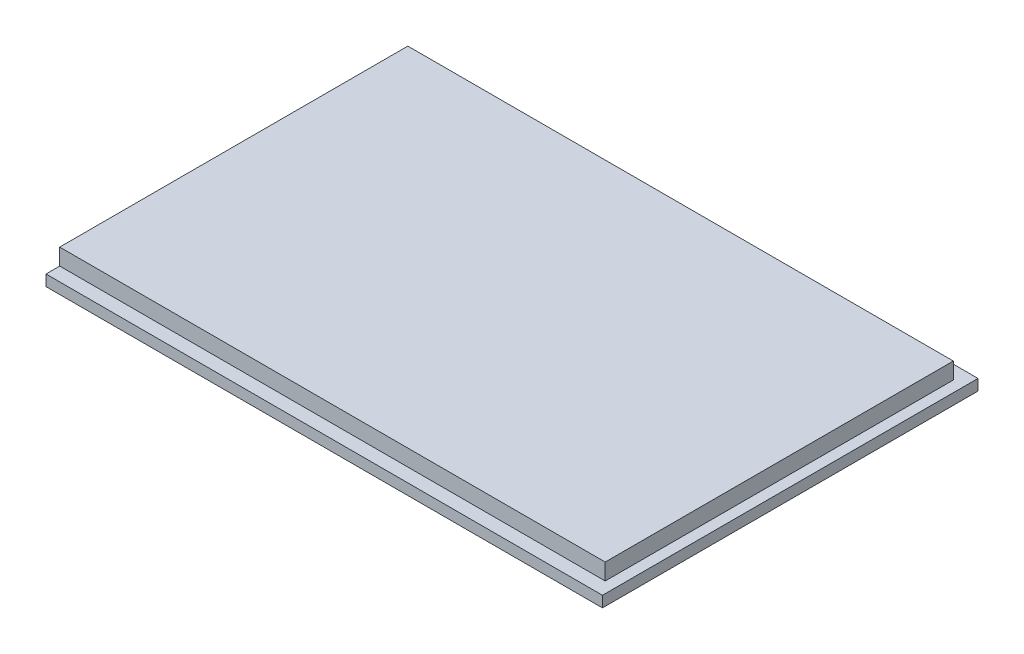
ISO-10303-21;
HEADER;
FILE_DESCRIPTION(('STEP AP214'),'2;1');
FILE_NAME('part.step','',(''),(''),'','','');
FILE_SCHEMA(('AUTOMOTIVE_DESIGN { 1 0 10303 214 1 1 1 1 }'));
ENDSEC;
DATA;
#1=APPLICATION_CONTEXT('core data for automotive mechanical design processes');
#2=APPLICATION_PROTOCOL_DEFINITION('international standard','automotive_design',2000,#1);
#3=PRODUCT_CONTEXT('',#1,'mechanical');
#4=PRODUCT('Part','Part','',(#3));
#5=PRODUCT_RELATED_PRODUCT_CATEGORY('part','',(#4));
#6=PRODUCT_DEFINITION_FORMATION('','',#4);
#7=PRODUCT_DEFINITION_CONTEXT('part definition',#1,'design');
#8=PRODUCT_DEFINITION('design','',#6,#7);
#9=PRODUCT_DEFINITION_SHAPE('','',#8);
#10=(LENGTH_UNIT() NAMED_UNIT(*) SI_UNIT(.MILLI.,.METRE.));
#11=(NAMED_UNIT(*) PLANE_ANGLE_UNIT() SI_UNIT($,.RADIAN.));
#12=(NAMED_UNIT(*) SI_UNIT($,.STERADIAN.) SOLID_ANGLE_UNIT());
#13=UNCERTAINTY_MEASURE_WITH_UNIT(LENGTH_MEASURE(1.E-05),#10,'distance_accuracy_value','');
#14=(GEOMETRIC_REPRESENTATION_CONTEXT(3) GLOBAL_UNCERTAINTY_ASSIGNED_CONTEXT((#13)) GLOBAL_UNIT_ASSIGNED_CONTEXT((#10,
#11,#12)) REPRESENTATION_CONTEXT('',''));
#15=CARTESIAN_POINT('',(0.,0.,0.));
#16=DIRECTION('',(0.,0.,1.));
#17=DIRECTION('',(1.,0.,0.));
#18=AXIS2_PLACEMENT_3D('',#15,#16,#17);
#19=CARTESIAN_POINT('',(20.3,0.8,-13.7));
#20=DIRECTION('',(-1.,0.,0.));
#21=DIRECTION('',(0.,0.,1.));
#22=AXIS2_PLACEMENT_3D('',#19,#20,#21);
#23=PLANE('',#22);
#24=DIRECTION('',(0.,0.,-1.));
#25=VECTOR('',#24,1.);
#26=CARTESIAN_POINT('',(20.3,0.,-13.7));
#27=LINE('',#26,#25);
#28=CARTESIAN_POINT('',(20.3,0.,13.7));
#29=VERTEX_POINT('',#28);
#30=CARTESIAN_POINT('',(20.3,0.,-13.7));
#31=VERTEX_POINT('',#30);
#32=EDGE_CURVE('E125',#29,#31,#27,.T.);
#33=ORIENTED_EDGE('',*,*,#32,.T.);
#34=DIRECTION('',(0.,-1.,0.));
#35=VECTOR('',#34,1.);
#36=CARTESIAN_POINT('',(20.3,0.8,-13.7));
#37=LINE('',#36,#35);
#38=CARTESIAN_POINT('',(20.3,0.8,-13.7));
#39=VERTEX_POINT('',#38);
#40=EDGE_CURVE('E11',#39,#31,#37,.T.);
#41=ORIENTED_EDGE('',*,*,#40,.F.);
#42=DIRECTION('',(0.,0.,-1.));
#43=VECTOR('',#42,1.);
#44=CARTESIAN_POINT('',(20.3,0.8,-13.7));
#45=LINE('',#44,#43);
#46=CARTESIAN_POINT('',(20.3,0.8,13.7));
#47=VERTEX_POINT('',#46);
#48=EDGE_CURVE('E134',#47,#39,#45,.T.);
#49=ORIENTED_EDGE('',*,*,#48,.F.);
#50=DIRECTION('',(0.,-1.,0.));
#51=VECTOR('',#50,1.);
#52=CARTESIAN_POINT('',(20.3,0.8,13.7));
#53=LINE('',#52,#51);
#54=EDGE_CURVE('E143',#47,#29,#53,.T.);
#55=ORIENTED_EDGE('',*,*,#54,.T.);
#56=EDGE_LOOP('',(#33,#41,#49,#55));
#57=FACE_BOUND('',#56,.T.);
#58=ADVANCED_FACE('F39',(#57),#23,.F.);
#59=CARTESIAN_POINT('',(-20.3,0.8,-13.7));
#60=DIRECTION('',(0.,0.,1.));
#61=DIRECTION('',(1.,0.,0.));
#62=AXIS2_PLACEMENT_3D('',#59,#60,#61);
#63=PLANE('',#62);
#64=DIRECTION('',(-1.,0.,0.));
#65=VECTOR('',#64,1.);
#66=CARTESIAN_POINT('',(-20.3,0.,-13.7));
#67=LINE('',#66,#65);
#68=CARTESIAN_POINT('',(-20.3,0.,-13.7));
#69=VERTEX_POINT('',#68);
#70=EDGE_CURVE('E128',#31,#69,#67,.T.);
#71=ORIENTED_EDGE('',*,*,#70,.T.);
#72=DIRECTION('',(0.,-1.,0.));
#73=VECTOR('',#72,1.);
#74=CARTESIAN_POINT('',(-20.3,0.8,-13.7));
#75=LINE('',#74,#73);
#76=CARTESIAN_POINT('',(-20.3,0.8,-13.7));
#77=VERTEX_POINT('',#76);
#78=EDGE_CURVE('E46',#77,#69,#75,.T.);
#79=ORIENTED_EDGE('',*,*,#78,.F.);
#80=DIRECTION('',(-1.,0.,0.));
#81=VECTOR('',#80,1.);
#82=CARTESIAN_POINT('',(-20.3,0.8,-13.7));
#83=LINE('',#82,#81);
#84=EDGE_CURVE('E137',#39,#77,#83,.T.);
#85=ORIENTED_EDGE('',*,*,#84,.F.);
#86=ORIENTED_EDGE('',*,*,#40,.T.);
#87=EDGE_LOOP('',(#71,#79,#85,#86));
#88=FACE_BOUND('',#87,.T.);
#89=ADVANCED_FACE('F170',(#88),#63,.F.);
#90=CARTESIAN_POINT('',(-20.3,0.8,-13.7));
#91=DIRECTION('',(1.,0.,0.));
#92=DIRECTION('',(0.,0.,-1.));
#93=AXIS2_PLACEMENT_3D('',#90,#91,#92);
#94=PLANE('',#93);
#95=DIRECTION('',(0.,0.,1.));
#96=VECTOR('',#95,1.);
#97=CARTESIAN_POINT('',(-20.3,0.,-13.7));
#98=LINE('',#97,#96);
#99=CARTESIAN_POINT('',(-20.3,0.,13.7));
#100=VERTEX_POINT('',#99);
#101=EDGE_CURVE('E146',#69,#100,#98,.T.);
#102=ORIENTED_EDGE('',*,*,#101,.T.);
#103=DIRECTION('',(0.,-1.,0.));
#104=VECTOR('',#103,1.);
#105=CARTESIAN_POINT('',(-20.3,0.8,13.7));
#106=LINE('',#105,#104);
#107=CARTESIAN_POINT('',(-20.3,0.8,13.7));
#108=VERTEX_POINT('',#107);
#109=EDGE_CURVE('E151',#108,#100,#106,.T.);
#110=ORIENTED_EDGE('',*,*,#109,.F.);
#111=DIRECTION('',(0.,0.,1.));
#112=VECTOR('',#111,1.);
#113=CARTESIAN_POINT('',(-20.3,0.8,-13.7));
#114=LINE('',#113,#112);
#115=CARTESIAN_POINT('',(-20.3,0.8,12.7));
#116=VERTEX_POINT('',#115);
#117=EDGE_CURVE('E124',#116,#108,#114,.T.);
#118=ORIENTED_EDGE('',*,*,#117,.F.);
#119=DIRECTION('',(0.,-1.,0.));
#120=VECTOR('',#119,1.);
#121=CARTESIAN_POINT('',(-20.3,2.,12.7));
#122=LINE('',#121,#120);
#123=CARTESIAN_POINT('',(-20.3,2.,12.7));
#124=VERTEX_POINT('',#123);
#125=EDGE_CURVE('E106',#124,#116,#122,.T.);
#126=ORIENTED_EDGE('',*,*,#125,.F.);
#127=DIRECTION('',(0.,0.,1.));
#128=VECTOR('',#127,1.);
#129=CARTESIAN_POINT('',(-20.3,2.,-12.7));
#130=LINE('',#129,#128);
#131=CARTESIAN_POINT('',(-20.3,2.,-12.7));
#132=VERTEX_POINT('',#131);
#133=EDGE_CURVE('E112',#132,#124,#130,.T.);
#134=ORIENTED_EDGE('',*,*,#133,.F.);
#135=DIRECTION('',(0.,-1.,0.));
#136=VECTOR('',#135,1.);
#137=CARTESIAN_POINT('',(-20.3,2.,-12.7));
#138=LINE('',#137,#136);
#139=CARTESIAN_POINT('',(-20.3,0.8,-12.7));
#140=VERTEX_POINT('',#139);
#141=EDGE_CURVE('E277',#132,#140,#138,.T.);
#142=ORIENTED_EDGE('',*,*,#141,.T.);
#143=EDGE_CURVE('E140',#77,#140,#114,.T.);
#144=ORIENTED_EDGE('',*,*,#143,.F.);
#145=ORIENTED_EDGE('',*,*,#78,.T.);
#146=EDGE_LOOP('',(#102,#110,#118,#126,#134,#142,#144,#145));
#147=FACE_BOUND('',#146,.T.);
#148=ADVANCED_FACE('F122',(#147),#94,.F.);
#149=CARTESIAN_POINT('',(-20.3,0.8,13.7));
#150=DIRECTION('',(0.,0.,-1.));
#151=DIRECTION('',(-1.,0.,0.));
#152=AXIS2_PLACEMENT_3D('',#149,#150,#151);
#153=PLANE('',#152);
#154=DIRECTION('',(1.,0.,0.));
#155=VECTOR('',#154,1.);
#156=CARTESIAN_POINT('',(-20.3,0.,13.7));
#157=LINE('',#156,#155);
#158=EDGE_CURVE('E138',#100,#29,#157,.T.);
#159=ORIENTED_EDGE('',*,*,#158,.T.);
#160=ORIENTED_EDGE('',*,*,#54,.F.);
#161=DIRECTION('',(1.,0.,0.));
#162=VECTOR('',#161,1.);
#163=CARTESIAN_POINT('',(-20.3,0.8,13.7));
#164=LINE('',#163,#162);
#165=EDGE_CURVE('E142',#108,#47,#164,.T.);
#166=ORIENTED_EDGE('',*,*,#165,.F.);
#167=ORIENTED_EDGE('',*,*,#109,.T.);
#168=EDGE_LOOP('',(#159,#160,#166,#167));
#169=FACE_BOUND('',#168,.T.);
#170=ADVANCED_FACE('F164',(#169),#153,.F.);
#171=CARTESIAN_POINT('',(0.,0.8,0.));
#172=DIRECTION('',(0.,1.,0.));
#173=DIRECTION('',(0.,0.,1.));
#174=AXIS2_PLACEMENT_3D('',#171,#172,#173);
#175=PLANE('',#174);
#176=DIRECTION('',(-1.,0.,0.));
#177=VECTOR('',#176,1.);
#178=CARTESIAN_POINT('',(-20.3,0.8,-12.7));
#179=LINE('',#178,#177);
#180=CARTESIAN_POINT('',(19.5,0.8,-12.7));
#181=VERTEX_POINT('',#180);
#182=EDGE_CURVE('E53',#181,#140,#179,.T.);
#183=ORIENTED_EDGE('',*,*,#182,.F.);
#184=DIRECTION('',(0.,0.,-1.));
#185=VECTOR('',#184,1.);
#186=CARTESIAN_POINT('',(19.5,0.8,-12.7));
#187=LINE('',#186,#185);
#188=CARTESIAN_POINT('',(19.5,0.8,12.7));
#189=VERTEX_POINT('',#188);
#190=EDGE_CURVE('E279',#189,#181,#187,.T.);
#191=ORIENTED_EDGE('',*,*,#190,.F.);
#192=DIRECTION('',(1.,0.,0.));
#193=VECTOR('',#192,1.);
#194=CARTESIAN_POINT('',(-20.3,0.8,12.7));
#195=LINE('',#194,#193);
#196=EDGE_CURVE('E59',#116,#189,#195,.T.);
#197=ORIENTED_EDGE('',*,*,#196,.F.);
#198=ORIENTED_EDGE('',*,*,#117,.T.);
#199=ORIENTED_EDGE('',*,*,#165,.T.);
#200=ORIENTED_EDGE('',*,*,#48,.T.);
#201=ORIENTED_EDGE('',*,*,#84,.T.);
#202=ORIENTED_EDGE('',*,*,#143,.T.);
#203=EDGE_LOOP('',(#183,#191,#197,#198,#199,#200,#201,#202));
#204=FACE_BOUND('',#203,.T.);
#205=ADVANCED_FACE('F169',(#204),#175,.T.);
#206=CARTESIAN_POINT('',(0.,0.,0.));
#207=DIRECTION('',(0.,1.,0.));
#208=DIRECTION('',(0.,0.,1.));
#209=AXIS2_PLACEMENT_3D('',#206,#207,#208);
#210=PLANE('',#209);
#211=ORIENTED_EDGE('',*,*,#32,.F.);
#212=ORIENTED_EDGE('',*,*,#158,.F.);
#213=ORIENTED_EDGE('',*,*,#101,.F.);
#214=ORIENTED_EDGE('',*,*,#70,.F.);
#215=EDGE_LOOP('',(#211,#212,#213,#214));
#216=FACE_BOUND('',#215,.T.);
#217=ADVANCED_FACE('F161',(#216),#210,.F.);
#218=CARTESIAN_POINT('',(-20.3,2.,12.7));
#219=DIRECTION('',(0.,0.,-1.));
#220=DIRECTION('',(-1.,0.,0.));
#221=AXIS2_PLACEMENT_3D('',#218,#219,#220);
#222=PLANE('',#221);
#223=ORIENTED_EDGE('',*,*,#196,.T.);
#224=DIRECTION('',(0.,-1.,0.));
#225=VECTOR('',#224,1.);
#226=CARTESIAN_POINT('',(19.5,2.,12.7));
#227=LINE('',#226,#225);
#228=CARTESIAN_POINT('',(19.5,2.,12.7));
#229=VERTEX_POINT('',#228);
#230=EDGE_CURVE('E108',#229,#189,#227,.T.);
#231=ORIENTED_EDGE('',*,*,#230,.F.);
#232=DIRECTION('',(1.,0.,0.));
#233=VECTOR('',#232,1.);
#234=CARTESIAN_POINT('',(-20.3,2.,12.7));
#235=LINE('',#234,#233);
#236=EDGE_CURVE('E102',#124,#229,#235,.T.);
#237=ORIENTED_EDGE('',*,*,#236,.F.);
#238=ORIENTED_EDGE('',*,*,#125,.T.);
#239=EDGE_LOOP('',(#223,#231,#237,#238));
#240=FACE_BOUND('',#239,.T.);
#241=ADVANCED_FACE('F104',(#240),#222,.F.);
#242=CARTESIAN_POINT('',(19.5,2.,-12.7));
#243=DIRECTION('',(-1.,0.,0.));
#244=DIRECTION('',(0.,0.,1.));
#245=AXIS2_PLACEMENT_3D('',#242,#243,#244);
#246=PLANE('',#245);
#247=ORIENTED_EDGE('',*,*,#190,.T.);
#248=DIRECTION('',(0.,-1.,0.));
#249=VECTOR('',#248,1.);
#250=CARTESIAN_POINT('',(19.5,2.,-12.7));
#251=LINE('',#250,#249);
#252=CARTESIAN_POINT('',(19.5,2.,-12.7));
#253=VERTEX_POINT('',#252);
#254=EDGE_CURVE('E130',#253,#181,#251,.T.);
#255=ORIENTED_EDGE('',*,*,#254,.F.);
#256=DIRECTION('',(0.,0.,-1.));
#257=VECTOR('',#256,1.);
#258=CARTESIAN_POINT('',(19.5,2.,-12.7));
#259=LINE('',#258,#257);
#260=EDGE_CURVE('E111',#229,#253,#259,.T.);
#261=ORIENTED_EDGE('',*,*,#260,.F.);
#262=ORIENTED_EDGE('',*,*,#230,.T.);
#263=EDGE_LOOP('',(#247,#255,#261,#262));
#264=FACE_BOUND('',#263,.T.);
#265=ADVANCED_FACE('F186',(#264),#246,.F.);
#266=CARTESIAN_POINT('',(-20.3,2.,-12.7));
#267=DIRECTION('',(0.,0.,1.));
#268=DIRECTION('',(1.,0.,0.));
#269=AXIS2_PLACEMENT_3D('',#266,#267,#268);
#270=PLANE('',#269);
#271=ORIENTED_EDGE('',*,*,#182,.T.);
#272=ORIENTED_EDGE('',*,*,#141,.F.);
#273=DIRECTION('',(-1.,0.,0.));
#274=VECTOR('',#273,1.);
#275=CARTESIAN_POINT('',(-20.3,2.,-12.7));
#276=LINE('',#275,#274);
#277=EDGE_CURVE('E117',#253,#132,#276,.T.);
#278=ORIENTED_EDGE('',*,*,#277,.F.);
#279=ORIENTED_EDGE('',*,*,#254,.T.);
#280=EDGE_LOOP('',(#271,#272,#278,#279));
#281=FACE_BOUND('',#280,.T.);
#282=ADVANCED_FACE('F189',(#281),#270,.F.);
#283=CARTESIAN_POINT('',(0.,2.,0.));
#284=DIRECTION('',(0.,1.,0.));
#285=DIRECTION('',(0.,0.,1.));
#286=AXIS2_PLACEMENT_3D('',#283,#284,#285);
#287=PLANE('',#286);
#288=ORIENTED_EDGE('',*,*,#133,.T.);
#289=ORIENTED_EDGE('',*,*,#236,.T.);
#290=ORIENTED_EDGE('',*,*,#260,.T.);
#291=ORIENTED_EDGE('',*,*,#277,.T.);
#292=EDGE_LOOP('',(#288,#289,#290,#291));
#293=FACE_BOUND('',#292,.T.);
#294=ADVANCED_FACE('F115',(#293),#287,.T.);
#295=CLOSED_SHELL('',(#58,#89,#148,#170,#205,#217,#241,#265,#282,#294));
#296=MANIFOLD_SOLID_BREP('B2',#295);
#297=ADVANCED_BREP_SHAPE_REPRESENTATION('',(#18,#296),#14);
#298=SHAPE_DEFINITION_REPRESENTATION(#9,#297);
ENDSEC;
END-ISO-10303-21;
